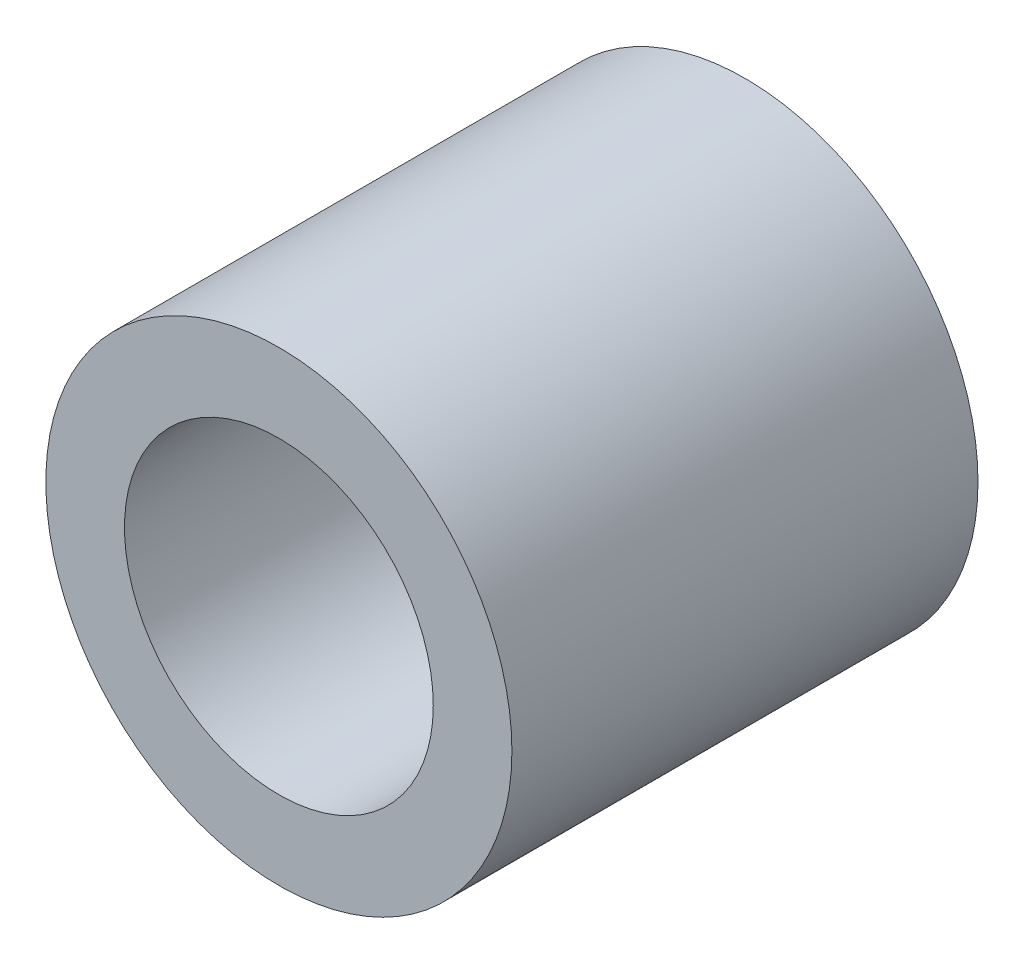
ISO-10303-21;
HEADER;
FILE_DESCRIPTION(('STEP AP214'),'2;1');
FILE_NAME('part.step','',(''),(''),'','','');
FILE_SCHEMA(('AUTOMOTIVE_DESIGN { 1 0 10303 214 1 1 1 1 }'));
ENDSEC;
DATA;
#1=APPLICATION_CONTEXT('core data for automotive mechanical design processes');
#2=APPLICATION_PROTOCOL_DEFINITION('international standard','automotive_design',2000,#1);
#3=PRODUCT_CONTEXT('',#1,'mechanical');
#4=PRODUCT('Part','Part','',(#3));
#5=PRODUCT_RELATED_PRODUCT_CATEGORY('part','',(#4));
#6=PRODUCT_DEFINITION_FORMATION('','',#4);
#7=PRODUCT_DEFINITION_CONTEXT('part definition',#1,'design');
#8=PRODUCT_DEFINITION('design','',#6,#7);
#9=PRODUCT_DEFINITION_SHAPE('','',#8);
#10=(LENGTH_UNIT() NAMED_UNIT(*) SI_UNIT(.MILLI.,.METRE.));
#11=(NAMED_UNIT(*) PLANE_ANGLE_UNIT() SI_UNIT($,.RADIAN.));
#12=(NAMED_UNIT(*) SI_UNIT($,.STERADIAN.) SOLID_ANGLE_UNIT());
#13=UNCERTAINTY_MEASURE_WITH_UNIT(LENGTH_MEASURE(1.E-05),#10,'distance_accuracy_value','');
#14=(GEOMETRIC_REPRESENTATION_CONTEXT(3) GLOBAL_UNCERTAINTY_ASSIGNED_CONTEXT((#13)) GLOBAL_UNIT_ASSIGNED_CONTEXT((#10,
#11,#12)) REPRESENTATION_CONTEXT('',''));
#15=CARTESIAN_POINT('',(0.,0.,0.));
#16=DIRECTION('',(0.,0.,1.));
#17=DIRECTION('',(1.,0.,0.));
#18=AXIS2_PLACEMENT_3D('',#15,#16,#17);
#19=CARTESIAN_POINT('',(0.,0.,-4.));
#20=DIRECTION('',(0.,0.,1.));
#21=DIRECTION('',(1.,0.,0.));
#22=AXIS2_PLACEMENT_3D('',#19,#20,#21);
#23=PLANE('',#22);
#24=CARTESIAN_POINT('',(0.,0.,-4.));
#25=DIRECTION('',(0.,0.,1.));
#26=DIRECTION('',(1.,0.,0.));
#27=AXIS2_PLACEMENT_3D('',#24,#25,#26);
#28=CIRCLE('',#27,2.65);
#29=CARTESIAN_POINT('',(2.65,0.,-4.));
#30=VERTEX_POINT('',#29);
#31=EDGE_CURVE('E20',#30,#30,#28,.T.);
#32=ORIENTED_EDGE('',*,*,#31,.T.);
#33=EDGE_LOOP('',(#32));
#34=FACE_BOUND('',#33,.T.);
#35=CARTESIAN_POINT('',(0.,0.,-4.));
#36=DIRECTION('',(0.,0.,1.));
#37=DIRECTION('',(1.,0.,0.));
#38=AXIS2_PLACEMENT_3D('',#35,#36,#37);
#39=CIRCLE('',#38,4.);
#40=CARTESIAN_POINT('',(4.,0.,-4.));
#41=VERTEX_POINT('',#40);
#42=EDGE_CURVE('E55',#41,#41,#39,.T.);
#43=ORIENTED_EDGE('',*,*,#42,.F.);
#44=EDGE_LOOP('',(#43));
#45=FACE_BOUND('',#44,.T.);
#46=ADVANCED_FACE('F16',(#34,#45),#23,.F.);
#47=CARTESIAN_POINT('',(0.,0.,4.));
#48=DIRECTION('',(0.,0.,1.));
#49=DIRECTION('',(1.,0.,0.));
#50=AXIS2_PLACEMENT_3D('',#47,#48,#49);
#51=PLANE('',#50);
#52=CARTESIAN_POINT('',(0.,0.,4.));
#53=DIRECTION('',(0.,0.,1.));
#54=DIRECTION('',(1.,0.,0.));
#55=AXIS2_PLACEMENT_3D('',#52,#53,#54);
#56=CIRCLE('',#55,2.65);
#57=CARTESIAN_POINT('',(2.65,0.,4.));
#58=VERTEX_POINT('',#57);
#59=EDGE_CURVE('E63',#58,#58,#56,.T.);
#60=ORIENTED_EDGE('',*,*,#59,.F.);
#61=EDGE_LOOP('',(#60));
#62=FACE_BOUND('',#61,.T.);
#63=CARTESIAN_POINT('',(0.,0.,4.));
#64=DIRECTION('',(0.,0.,1.));
#65=DIRECTION('',(1.,0.,0.));
#66=AXIS2_PLACEMENT_3D('',#63,#64,#65);
#67=CIRCLE('',#66,4.);
#68=CARTESIAN_POINT('',(4.,0.,4.));
#69=VERTEX_POINT('',#68);
#70=EDGE_CURVE('E11',#69,#69,#67,.T.);
#71=ORIENTED_EDGE('',*,*,#70,.T.);
#72=EDGE_LOOP('',(#71));
#73=FACE_BOUND('',#72,.T.);
#74=ADVANCED_FACE('F76',(#62,#73),#51,.T.);
#75=CARTESIAN_POINT('',(0.,0.,4.));
#76=DIRECTION('',(0.,0.,-1.));
#77=DIRECTION('',(-1.,0.,0.));
#78=AXIS2_PLACEMENT_3D('',#75,#76,#77);
#79=CYLINDRICAL_SURFACE('',#78,4.);
#80=ORIENTED_EDGE('',*,*,#42,.T.);
#81=DIRECTION('',(0.,0.,1.));
#82=VECTOR('',#81,1.);
#83=CARTESIAN_POINT('',(4.,0.,4.));
#84=LINE('',#83,#82);
#85=EDGE_CURVE('E27',#41,#69,#84,.T.);
#86=ORIENTED_EDGE('',*,*,#85,.T.);
#87=ORIENTED_EDGE('',*,*,#70,.F.);
#88=ORIENTED_EDGE('',*,*,#85,.F.);
#89=EDGE_LOOP('',(#80,#86,#87,#88));
#90=FACE_BOUND('',#89,.T.);
#91=ADVANCED_FACE('F18',(#90),#79,.T.);
#92=CARTESIAN_POINT('',(0.,0.,4.));
#93=DIRECTION('',(0.,0.,-1.));
#94=DIRECTION('',(-1.,0.,0.));
#95=AXIS2_PLACEMENT_3D('',#92,#93,#94);
#96=CYLINDRICAL_SURFACE('',#95,2.65);
#97=ORIENTED_EDGE('',*,*,#59,.T.);
#98=DIRECTION('',(0.,0.,-1.));
#99=VECTOR('',#98,1.);
#100=CARTESIAN_POINT('',(2.65,0.,4.));
#101=LINE('',#100,#99);
#102=EDGE_CURVE('E48',#58,#30,#101,.T.);
#103=ORIENTED_EDGE('',*,*,#102,.T.);
#104=ORIENTED_EDGE('',*,*,#31,.F.);
#105=ORIENTED_EDGE('',*,*,#102,.F.);
#106=EDGE_LOOP('',(#97,#103,#104,#105));
#107=FACE_BOUND('',#106,.T.);
#108=ADVANCED_FACE('F84',(#107),#96,.F.);
#109=CLOSED_SHELL('',(#46,#74,#91,#108));
#110=MANIFOLD_SOLID_BREP('B1',#109);
#111=ADVANCED_BREP_SHAPE_REPRESENTATION('',(#18,#110),#14);
#112=SHAPE_DEFINITION_REPRESENTATION(#9,#111);
ENDSEC;
END-ISO-10303-21;
